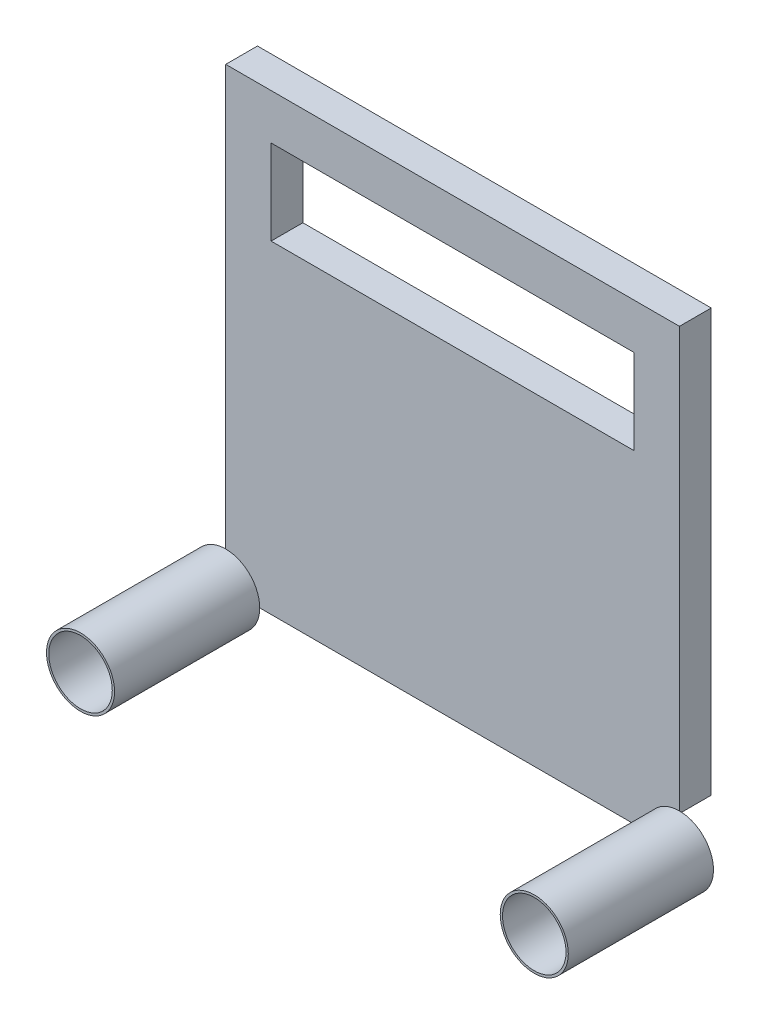
ISO-10303-21;
HEADER;
FILE_DESCRIPTION(('STEP AP214'),'2;1');
FILE_NAME('part.step','',(''),(''),'','','');
FILE_SCHEMA(('AUTOMOTIVE_DESIGN { 1 0 10303 214 1 1 1 1 }'));
ENDSEC;
DATA;
#1=APPLICATION_CONTEXT('core data for automotive mechanical design processes');
#2=APPLICATION_PROTOCOL_DEFINITION('international standard','automotive_design',2000,#1);
#3=PRODUCT_CONTEXT('',#1,'mechanical');
#4=PRODUCT('Part','Part','',(#3));
#5=PRODUCT_RELATED_PRODUCT_CATEGORY('part','',(#4));
#6=PRODUCT_DEFINITION_FORMATION('','',#4);
#7=PRODUCT_DEFINITION_CONTEXT('part definition',#1,'design');
#8=PRODUCT_DEFINITION('design','',#6,#7);
#9=PRODUCT_DEFINITION_SHAPE('','',#8);
#10=(LENGTH_UNIT() NAMED_UNIT(*) SI_UNIT(.MILLI.,.METRE.));
#11=(NAMED_UNIT(*) PLANE_ANGLE_UNIT() SI_UNIT($,.RADIAN.));
#12=(NAMED_UNIT(*) SI_UNIT($,.STERADIAN.) SOLID_ANGLE_UNIT());
#13=UNCERTAINTY_MEASURE_WITH_UNIT(LENGTH_MEASURE(1.E-05),#10,'distance_accuracy_value','');
#14=(GEOMETRIC_REPRESENTATION_CONTEXT(3) GLOBAL_UNCERTAINTY_ASSIGNED_CONTEXT((#13)) GLOBAL_UNIT_ASSIGNED_CONTEXT((#10,
#11,#12)) REPRESENTATION_CONTEXT('',''));
#15=CARTESIAN_POINT('',(0.,0.,0.));
#16=DIRECTION('',(0.,0.,1.));
#17=DIRECTION('',(1.,0.,0.));
#18=AXIS2_PLACEMENT_3D('',#15,#16,#17);
#19=CARTESIAN_POINT('',(0.,0.,3.5));
#20=DIRECTION('',(1.,0.,0.));
#21=DIRECTION('',(0.,0.,-1.));
#22=AXIS2_PLACEMENT_3D('',#19,#20,#21);
#23=PLANE('',#22);
#24=DIRECTION('',(0.,-1.,0.));
#25=VECTOR('',#24,1.);
#26=CARTESIAN_POINT('',(0.,0.,0.));
#27=LINE('',#26,#25);
#28=CARTESIAN_POINT('',(0.,50.,0.));
#29=VERTEX_POINT('',#28);
#30=CARTESIAN_POINT('',(0.,3.5,0.));
#31=VERTEX_POINT('',#30);
#32=EDGE_CURVE('E193',#29,#31,#27,.T.);
#33=ORIENTED_EDGE('',*,*,#32,.T.);
#34=DIRECTION('',(0.,0.,1.));
#35=VECTOR('',#34,1.);
#36=CARTESIAN_POINT('',(0.,3.5,0.));
#37=LINE('',#36,#35);
#38=CARTESIAN_POINT('',(0.,3.5,3.5));
#39=VERTEX_POINT('',#38);
#40=EDGE_CURVE('E179',#31,#39,#37,.T.);
#41=ORIENTED_EDGE('',*,*,#40,.T.);
#42=DIRECTION('',(0.,-1.,0.));
#43=VECTOR('',#42,1.);
#44=CARTESIAN_POINT('',(0.,0.,3.5));
#45=LINE('',#44,#43);
#46=CARTESIAN_POINT('',(0.,3.75,3.5));
#47=VERTEX_POINT('',#46);
#48=EDGE_CURVE('E200',#47,#39,#45,.T.);
#49=ORIENTED_EDGE('',*,*,#48,.F.);
#50=CARTESIAN_POINT('',(0.,50.,3.5));
#51=VERTEX_POINT('',#50);
#52=EDGE_CURVE('E197',#51,#47,#45,.T.);
#53=ORIENTED_EDGE('',*,*,#52,.F.);
#54=DIRECTION('',(0.,0.,-1.));
#55=VECTOR('',#54,1.);
#56=CARTESIAN_POINT('',(0.,50.,3.5));
#57=LINE('',#56,#55);
#58=EDGE_CURVE('E209',#51,#29,#57,.T.);
#59=ORIENTED_EDGE('',*,*,#58,.T.);
#60=EDGE_LOOP('',(#33,#41,#49,#53,#59));
#61=FACE_BOUND('',#60,.T.);
#62=ADVANCED_FACE('F37',(#61),#23,.F.);
#63=CARTESIAN_POINT('',(0.,0.,3.5));
#64=DIRECTION('',(0.,1.,0.));
#65=DIRECTION('',(0.,0.,1.));
#66=AXIS2_PLACEMENT_3D('',#63,#64,#65);
#67=PLANE('',#66);
#68=DIRECTION('',(1.,0.,0.));
#69=VECTOR('',#68,1.);
#70=CARTESIAN_POINT('',(0.,0.,3.5));
#71=LINE('',#70,#69);
#72=CARTESIAN_POINT('',(3.5,0.,3.5));
#73=VERTEX_POINT('',#72);
#74=CARTESIAN_POINT('',(3.75,0.,3.5));
#75=VERTEX_POINT('',#74);
#76=EDGE_CURVE('E201',#73,#75,#71,.T.);
#77=ORIENTED_EDGE('',*,*,#76,.F.);
#78=DIRECTION('',(0.,0.,1.));
#79=VECTOR('',#78,1.);
#80=CARTESIAN_POINT('',(3.5,0.,0.));
#81=LINE('',#80,#79);
#82=CARTESIAN_POINT('',(3.5,0.,0.));
#83=VERTEX_POINT('',#82);
#84=EDGE_CURVE('E176',#73,#83,#81,.F.);
#85=ORIENTED_EDGE('',*,*,#84,.T.);
#86=DIRECTION('',(1.,0.,0.));
#87=VECTOR('',#86,1.);
#88=CARTESIAN_POINT('',(0.,0.,0.));
#89=LINE('',#88,#87);
#90=CARTESIAN_POINT('',(46.5,0.,0.));
#91=VERTEX_POINT('',#90);
#92=EDGE_CURVE('E212',#83,#91,#89,.T.);
#93=ORIENTED_EDGE('',*,*,#92,.T.);
#94=DIRECTION('',(0.,0.,1.));
#95=VECTOR('',#94,1.);
#96=CARTESIAN_POINT('',(46.5,0.,0.));
#97=LINE('',#96,#95);
#98=CARTESIAN_POINT('',(46.5,0.,3.5));
#99=VERTEX_POINT('',#98);
#100=EDGE_CURVE('E170',#91,#99,#97,.T.);
#101=ORIENTED_EDGE('',*,*,#100,.T.);
#102=CARTESIAN_POINT('',(46.25,0.,3.5));
#103=VERTEX_POINT('',#102);
#104=EDGE_CURVE('E199',#103,#99,#71,.T.);
#105=ORIENTED_EDGE('',*,*,#104,.F.);
#106=EDGE_CURVE('E204',#75,#103,#71,.T.);
#107=ORIENTED_EDGE('',*,*,#106,.F.);
#108=EDGE_LOOP('',(#77,#85,#93,#101,#105,#107));
#109=FACE_BOUND('',#108,.T.);
#110=ADVANCED_FACE('F248',(#109),#67,.F.);
#111=CARTESIAN_POINT('',(50.,0.,3.5));
#112=DIRECTION('',(-1.,0.,0.));
#113=DIRECTION('',(0.,0.,1.));
#114=AXIS2_PLACEMENT_3D('',#111,#112,#113);
#115=PLANE('',#114);
#116=DIRECTION('',(0.,1.,0.));
#117=VECTOR('',#116,1.);
#118=CARTESIAN_POINT('',(50.,0.,3.5));
#119=LINE('',#118,#117);
#120=CARTESIAN_POINT('',(50.,3.5,3.5));
#121=VERTEX_POINT('',#120);
#122=CARTESIAN_POINT('',(50.,3.75000000000001,3.5));
#123=VERTEX_POINT('',#122);
#124=EDGE_CURVE('E205',#121,#123,#119,.T.);
#125=ORIENTED_EDGE('',*,*,#124,.F.);
#126=DIRECTION('',(0.,0.,1.));
#127=VECTOR('',#126,1.);
#128=CARTESIAN_POINT('',(50.,3.5,0.));
#129=LINE('',#128,#127);
#130=CARTESIAN_POINT('',(50.,3.5,0.));
#131=VERTEX_POINT('',#130);
#132=EDGE_CURVE('E167',#121,#131,#129,.F.);
#133=ORIENTED_EDGE('',*,*,#132,.T.);
#134=DIRECTION('',(0.,1.,0.));
#135=VECTOR('',#134,1.);
#136=CARTESIAN_POINT('',(50.,0.,0.));
#137=LINE('',#136,#135);
#138=CARTESIAN_POINT('',(50.,50.,0.));
#139=VERTEX_POINT('',#138);
#140=EDGE_CURVE('E215',#131,#139,#137,.T.);
#141=ORIENTED_EDGE('',*,*,#140,.T.);
#142=DIRECTION('',(0.,0.,-1.));
#143=VECTOR('',#142,1.);
#144=CARTESIAN_POINT('',(50.,50.,3.5));
#145=LINE('',#144,#143);
#146=CARTESIAN_POINT('',(50.,50.,3.5));
#147=VERTEX_POINT('',#146);
#148=EDGE_CURVE('E221',#147,#139,#145,.T.);
#149=ORIENTED_EDGE('',*,*,#148,.F.);
#150=EDGE_CURVE('E203',#123,#147,#119,.T.);
#151=ORIENTED_EDGE('',*,*,#150,.F.);
#152=EDGE_LOOP('',(#125,#133,#141,#149,#151));
#153=FACE_BOUND('',#152,.T.);
#154=ADVANCED_FACE('F253',(#153),#115,.F.);
#155=CARTESIAN_POINT('',(0.,50.,3.5));
#156=DIRECTION('',(0.,-1.,0.));
#157=DIRECTION('',(0.,0.,-1.));
#158=AXIS2_PLACEMENT_3D('',#155,#156,#157);
#159=PLANE('',#158);
#160=DIRECTION('',(-1.,0.,0.));
#161=VECTOR('',#160,1.);
#162=CARTESIAN_POINT('',(0.,50.,0.));
#163=LINE('',#162,#161);
#164=EDGE_CURVE('E217',#139,#29,#163,.T.);
#165=ORIENTED_EDGE('',*,*,#164,.T.);
#166=ORIENTED_EDGE('',*,*,#58,.F.);
#167=DIRECTION('',(-1.,0.,0.));
#168=VECTOR('',#167,1.);
#169=CARTESIAN_POINT('',(0.,50.,3.5));
#170=LINE('',#169,#168);
#171=EDGE_CURVE('E207',#147,#51,#170,.T.);
#172=ORIENTED_EDGE('',*,*,#171,.F.);
#173=ORIENTED_EDGE('',*,*,#148,.T.);
#174=EDGE_LOOP('',(#165,#166,#172,#173));
#175=FACE_BOUND('',#174,.T.);
#176=ADVANCED_FACE('F291',(#175),#159,.F.);
#177=CARTESIAN_POINT('',(0.,0.,3.5));
#178=DIRECTION('',(0.,0.,-1.));
#179=DIRECTION('',(-1.,0.,0.));
#180=AXIS2_PLACEMENT_3D('',#177,#178,#179);
#181=PLANE('',#180);
#182=DIRECTION('',(1.,0.,0.));
#183=VECTOR('',#182,1.);
#184=CARTESIAN_POINT('',(5.,35.6323831786116,3.5));
#185=LINE('',#184,#183);
#186=CARTESIAN_POINT('',(5.,35.6323831786116,3.5));
#187=VERTEX_POINT('',#186);
#188=CARTESIAN_POINT('',(45.,35.6323831786116,3.5));
#189=VERTEX_POINT('',#188);
#190=EDGE_CURVE('E136',#187,#189,#185,.T.);
#191=ORIENTED_EDGE('',*,*,#190,.F.);
#192=DIRECTION('',(0.,-1.,0.));
#193=VECTOR('',#192,1.);
#194=CARTESIAN_POINT('',(5.,35.6323831786116,3.5));
#195=LINE('',#194,#193);
#196=CARTESIAN_POINT('',(5.,45.,3.5));
#197=VERTEX_POINT('',#196);
#198=EDGE_CURVE('E51',#197,#187,#195,.T.);
#199=ORIENTED_EDGE('',*,*,#198,.F.);
#200=DIRECTION('',(-1.,0.,0.));
#201=VECTOR('',#200,1.);
#202=CARTESIAN_POINT('',(5.,45.,3.5));
#203=LINE('',#202,#201);
#204=CARTESIAN_POINT('',(45.,45.,3.5));
#205=VERTEX_POINT('',#204);
#206=EDGE_CURVE('E143',#205,#197,#203,.T.);
#207=ORIENTED_EDGE('',*,*,#206,.F.);
#208=DIRECTION('',(0.,1.,0.));
#209=VECTOR('',#208,1.);
#210=CARTESIAN_POINT('',(45.,35.6323831786116,3.5));
#211=LINE('',#210,#209);
#212=EDGE_CURVE('E127',#189,#205,#211,.T.);
#213=ORIENTED_EDGE('',*,*,#212,.F.);
#214=EDGE_LOOP('',(#191,#199,#207,#213));
#215=FACE_BOUND('',#214,.T.);
#216=CARTESIAN_POINT('',(50.,0.,3.5));
#217=DIRECTION('',(0.,0.,1.));
#218=DIRECTION('',(1.,0.,0.));
#219=AXIS2_PLACEMENT_3D('',#216,#217,#218);
#220=CIRCLE('',#219,3.75000000000001);
#221=EDGE_CURVE('E183',#123,#103,#220,.T.);
#222=ORIENTED_EDGE('',*,*,#221,.F.);
#223=ORIENTED_EDGE('',*,*,#150,.T.);
#224=ORIENTED_EDGE('',*,*,#171,.T.);
#225=ORIENTED_EDGE('',*,*,#52,.T.);
#226=CARTESIAN_POINT('',(0.,0.,3.5));
#227=DIRECTION('',(0.,0.,1.));
#228=DIRECTION('',(1.,0.,0.));
#229=AXIS2_PLACEMENT_3D('',#226,#227,#228);
#230=CIRCLE('',#229,3.75);
#231=EDGE_CURVE('E194',#75,#47,#230,.T.);
#232=ORIENTED_EDGE('',*,*,#231,.F.);
#233=ORIENTED_EDGE('',*,*,#106,.T.);
#234=EDGE_LOOP('',(#222,#223,#224,#225,#232,#233));
#235=FACE_BOUND('',#234,.T.);
#236=ADVANCED_FACE('F140',(#215,#235),#181,.F.);
#237=CARTESIAN_POINT('',(0.,0.,0.));
#238=DIRECTION('',(0.,0.,-1.));
#239=DIRECTION('',(-1.,0.,0.));
#240=AXIS2_PLACEMENT_3D('',#237,#238,#239);
#241=PLANE('',#240);
#242=DIRECTION('',(0.,1.,0.));
#243=VECTOR('',#242,1.);
#244=CARTESIAN_POINT('',(5.,0.,0.));
#245=LINE('',#244,#243);
#246=CARTESIAN_POINT('',(5.,35.6323831786116,0.));
#247=VERTEX_POINT('',#246);
#248=CARTESIAN_POINT('',(5.,45.,0.));
#249=VERTEX_POINT('',#248);
#250=EDGE_CURVE('E11',#247,#249,#245,.T.);
#251=ORIENTED_EDGE('',*,*,#250,.F.);
#252=DIRECTION('',(-1.,0.,0.));
#253=VECTOR('',#252,1.);
#254=CARTESIAN_POINT('',(0.,35.6323831786116,0.));
#255=LINE('',#254,#253);
#256=CARTESIAN_POINT('',(45.,35.6323831786116,0.));
#257=VERTEX_POINT('',#256);
#258=EDGE_CURVE('E224',#257,#247,#255,.T.);
#259=ORIENTED_EDGE('',*,*,#258,.F.);
#260=DIRECTION('',(0.,-1.,0.));
#261=VECTOR('',#260,1.);
#262=CARTESIAN_POINT('',(45.,0.,0.));
#263=LINE('',#262,#261);
#264=CARTESIAN_POINT('',(45.,45.,0.));
#265=VERTEX_POINT('',#264);
#266=EDGE_CURVE('E130',#265,#257,#263,.T.);
#267=ORIENTED_EDGE('',*,*,#266,.F.);
#268=DIRECTION('',(1.,0.,0.));
#269=VECTOR('',#268,1.);
#270=CARTESIAN_POINT('',(0.,45.,0.));
#271=LINE('',#270,#269);
#272=EDGE_CURVE('E44',#249,#265,#271,.T.);
#273=ORIENTED_EDGE('',*,*,#272,.F.);
#274=EDGE_LOOP('',(#251,#259,#267,#273));
#275=FACE_BOUND('',#274,.T.);
#276=CARTESIAN_POINT('',(0.,0.,0.));
#277=DIRECTION('',(0.,0.,1.));
#278=DIRECTION('',(1.,0.,0.));
#279=AXIS2_PLACEMENT_3D('',#276,#277,#278);
#280=CIRCLE('',#279,3.5);
#281=EDGE_CURVE('E153',#83,#31,#280,.T.);
#282=ORIENTED_EDGE('',*,*,#281,.T.);
#283=ORIENTED_EDGE('',*,*,#32,.F.);
#284=ORIENTED_EDGE('',*,*,#164,.F.);
#285=ORIENTED_EDGE('',*,*,#140,.F.);
#286=CARTESIAN_POINT('',(50.,0.,0.));
#287=DIRECTION('',(0.,0.,1.));
#288=DIRECTION('',(1.,0.,0.));
#289=AXIS2_PLACEMENT_3D('',#286,#287,#288);
#290=CIRCLE('',#289,3.5);
#291=EDGE_CURVE('E150',#131,#91,#290,.T.);
#292=ORIENTED_EDGE('',*,*,#291,.T.);
#293=ORIENTED_EDGE('',*,*,#92,.F.);
#294=EDGE_LOOP('',(#282,#283,#284,#285,#292,#293));
#295=FACE_BOUND('',#294,.T.);
#296=ADVANCED_FACE('F232',(#275,#295),#241,.T.);
#297=CARTESIAN_POINT('',(0.,0.,3.5));
#298=DIRECTION('',(0.,0.,1.));
#299=DIRECTION('',(1.,0.,0.));
#300=AXIS2_PLACEMENT_3D('',#297,#298,#299);
#301=PLANE('',#300);
#302=ORIENTED_EDGE('',*,*,#48,.T.);
#303=CARTESIAN_POINT('',(0.,0.,3.5));
#304=DIRECTION('',(0.,0.,1.));
#305=DIRECTION('',(1.,0.,0.));
#306=AXIS2_PLACEMENT_3D('',#303,#304,#305);
#307=CIRCLE('',#306,3.5);
#308=EDGE_CURVE('E173',#39,#73,#307,.T.);
#309=ORIENTED_EDGE('',*,*,#308,.T.);
#310=ORIENTED_EDGE('',*,*,#76,.T.);
#311=EDGE_CURVE('E186',#47,#75,#230,.T.);
#312=ORIENTED_EDGE('',*,*,#311,.F.);
#313=EDGE_LOOP('',(#302,#309,#310,#312));
#314=FACE_BOUND('',#313,.T.);
#315=ADVANCED_FACE('F271',(#314),#301,.F.);
#316=CARTESIAN_POINT('',(0.,0.,19.5));
#317=DIRECTION('',(0.,0.,-1.));
#318=DIRECTION('',(-1.,0.,0.));
#319=AXIS2_PLACEMENT_3D('',#316,#317,#318);
#320=CYLINDRICAL_SURFACE('',#319,3.75);
#321=CARTESIAN_POINT('',(0.,0.,19.5));
#322=DIRECTION('',(0.,0.,1.));
#323=DIRECTION('',(1.,0.,0.));
#324=AXIS2_PLACEMENT_3D('',#321,#322,#323);
#325=CIRCLE('',#324,3.75);
#326=CARTESIAN_POINT('',(3.75,0.,19.5));
#327=VERTEX_POINT('',#326);
#328=EDGE_CURVE('E190',#327,#327,#325,.T.);
#329=ORIENTED_EDGE('',*,*,#328,.F.);
#330=EDGE_LOOP('',(#329));
#331=FACE_BOUND('',#330,.T.);
#332=ORIENTED_EDGE('',*,*,#231,.T.);
#333=ORIENTED_EDGE('',*,*,#311,.T.);
#334=EDGE_LOOP('',(#332,#333));
#335=FACE_BOUND('',#334,.T.);
#336=ADVANCED_FACE('F274',(#331,#335),#320,.T.);
#337=CARTESIAN_POINT('',(0.,0.,19.5));
#338=DIRECTION('',(0.,0.,1.));
#339=DIRECTION('',(1.,0.,0.));
#340=AXIS2_PLACEMENT_3D('',#337,#338,#339);
#341=PLANE('',#340);
#342=CARTESIAN_POINT('',(0.,0.,19.5));
#343=DIRECTION('',(0.,0.,1.));
#344=DIRECTION('',(1.,0.,0.));
#345=AXIS2_PLACEMENT_3D('',#342,#343,#344);
#346=CIRCLE('',#345,3.5);
#347=CARTESIAN_POINT('',(3.5,0.,19.5));
#348=VERTEX_POINT('',#347);
#349=EDGE_CURVE('E157',#348,#348,#346,.T.);
#350=ORIENTED_EDGE('',*,*,#349,.F.);
#351=EDGE_LOOP('',(#350));
#352=FACE_BOUND('',#351,.T.);
#353=ORIENTED_EDGE('',*,*,#328,.T.);
#354=EDGE_LOOP('',(#353));
#355=FACE_BOUND('',#354,.T.);
#356=ADVANCED_FACE('F276',(#352,#355),#341,.T.);
#357=CARTESIAN_POINT('',(50.,0.,3.5));
#358=DIRECTION('',(0.,0.,1.));
#359=DIRECTION('',(1.,0.,0.));
#360=AXIS2_PLACEMENT_3D('',#357,#358,#359);
#361=PLANE('',#360);
#362=ORIENTED_EDGE('',*,*,#104,.T.);
#363=CARTESIAN_POINT('',(50.,0.,3.5));
#364=DIRECTION('',(0.,0.,1.));
#365=DIRECTION('',(1.,0.,0.));
#366=AXIS2_PLACEMENT_3D('',#363,#364,#365);
#367=CIRCLE('',#366,3.5);
#368=EDGE_CURVE('E156',#99,#121,#367,.T.);
#369=ORIENTED_EDGE('',*,*,#368,.T.);
#370=ORIENTED_EDGE('',*,*,#124,.T.);
#371=EDGE_CURVE('E187',#103,#123,#220,.T.);
#372=ORIENTED_EDGE('',*,*,#371,.F.);
#373=EDGE_LOOP('',(#362,#369,#370,#372));
#374=FACE_BOUND('',#373,.T.);
#375=ADVANCED_FACE('F283',(#374),#361,.F.);
#376=CARTESIAN_POINT('',(50.,0.,19.5));
#377=DIRECTION('',(0.,0.,-1.));
#378=DIRECTION('',(-1.,0.,0.));
#379=AXIS2_PLACEMENT_3D('',#376,#377,#378);
#380=CYLINDRICAL_SURFACE('',#379,3.75000000000001);
#381=CARTESIAN_POINT('',(50.,0.,19.5));
#382=DIRECTION('',(0.,0.,1.));
#383=DIRECTION('',(1.,0.,0.));
#384=AXIS2_PLACEMENT_3D('',#381,#382,#383);
#385=CIRCLE('',#384,3.75000000000001);
#386=CARTESIAN_POINT('',(53.75,0.,19.5));
#387=VERTEX_POINT('',#386);
#388=EDGE_CURVE('E182',#387,#387,#385,.T.);
#389=ORIENTED_EDGE('',*,*,#388,.F.);
#390=EDGE_LOOP('',(#389));
#391=FACE_BOUND('',#390,.T.);
#392=ORIENTED_EDGE('',*,*,#221,.T.);
#393=ORIENTED_EDGE('',*,*,#371,.T.);
#394=EDGE_LOOP('',(#392,#393));
#395=FACE_BOUND('',#394,.T.);
#396=ADVANCED_FACE('F309',(#391,#395),#380,.T.);
#397=CARTESIAN_POINT('',(50.,0.,19.5));
#398=DIRECTION('',(0.,0.,1.));
#399=DIRECTION('',(1.,0.,0.));
#400=AXIS2_PLACEMENT_3D('',#397,#398,#399);
#401=PLANE('',#400);
#402=CARTESIAN_POINT('',(50.,0.,19.5));
#403=DIRECTION('',(0.,0.,1.));
#404=DIRECTION('',(1.,0.,0.));
#405=AXIS2_PLACEMENT_3D('',#402,#403,#404);
#406=CIRCLE('',#405,3.5);
#407=CARTESIAN_POINT('',(53.5,0.,19.5));
#408=VERTEX_POINT('',#407);
#409=EDGE_CURVE('E160',#408,#408,#406,.T.);
#410=ORIENTED_EDGE('',*,*,#409,.F.);
#411=EDGE_LOOP('',(#410));
#412=FACE_BOUND('',#411,.T.);
#413=ORIENTED_EDGE('',*,*,#388,.T.);
#414=EDGE_LOOP('',(#413));
#415=FACE_BOUND('',#414,.T.);
#416=ADVANCED_FACE('F311',(#412,#415),#401,.T.);
#417=CARTESIAN_POINT('',(50.,0.,0.));
#418=DIRECTION('',(0.,0.,1.));
#419=DIRECTION('',(1.,0.,0.));
#420=AXIS2_PLACEMENT_3D('',#417,#418,#419);
#421=CYLINDRICAL_SURFACE('',#420,3.5);
#422=ORIENTED_EDGE('',*,*,#409,.T.);
#423=EDGE_LOOP('',(#422));
#424=FACE_BOUND('',#423,.T.);
#425=ORIENTED_EDGE('',*,*,#291,.F.);
#426=ORIENTED_EDGE('',*,*,#132,.F.);
#427=ORIENTED_EDGE('',*,*,#368,.F.);
#428=ORIENTED_EDGE('',*,*,#100,.F.);
#429=EDGE_LOOP('',(#425,#426,#427,#428));
#430=FACE_BOUND('',#429,.T.);
#431=ADVANCED_FACE('F243',(#424,#430),#421,.F.);
#432=CARTESIAN_POINT('',(0.,0.,0.));
#433=DIRECTION('',(0.,0.,1.));
#434=DIRECTION('',(1.,0.,0.));
#435=AXIS2_PLACEMENT_3D('',#432,#433,#434);
#436=CYLINDRICAL_SURFACE('',#435,3.5);
#437=ORIENTED_EDGE('',*,*,#349,.T.);
#438=EDGE_LOOP('',(#437));
#439=FACE_BOUND('',#438,.T.);
#440=ORIENTED_EDGE('',*,*,#281,.F.);
#441=ORIENTED_EDGE('',*,*,#84,.F.);
#442=ORIENTED_EDGE('',*,*,#308,.F.);
#443=ORIENTED_EDGE('',*,*,#40,.F.);
#444=EDGE_LOOP('',(#440,#441,#442,#443));
#445=FACE_BOUND('',#444,.T.);
#446=ADVANCED_FACE('F236',(#439,#445),#436,.F.);
#447=CARTESIAN_POINT('',(5.,35.6323831786116,-16.));
#448=DIRECTION('',(-1.,0.,0.));
#449=DIRECTION('',(0.,0.,1.));
#450=AXIS2_PLACEMENT_3D('',#447,#448,#449);
#451=PLANE('',#450);
#452=ORIENTED_EDGE('',*,*,#250,.T.);
#453=DIRECTION('',(0.,0.,1.));
#454=VECTOR('',#453,1.);
#455=CARTESIAN_POINT('',(5.,45.,-16.));
#456=LINE('',#455,#454);
#457=EDGE_CURVE('E148',#249,#197,#456,.T.);
#458=ORIENTED_EDGE('',*,*,#457,.T.);
#459=ORIENTED_EDGE('',*,*,#198,.T.);
#460=DIRECTION('',(0.,0.,1.));
#461=VECTOR('',#460,1.);
#462=CARTESIAN_POINT('',(5.,35.6323831786116,-16.));
#463=LINE('',#462,#461);
#464=EDGE_CURVE('E133',#247,#187,#463,.T.);
#465=ORIENTED_EDGE('',*,*,#464,.F.);
#466=EDGE_LOOP('',(#452,#458,#459,#465));
#467=FACE_BOUND('',#466,.T.);
#468=ADVANCED_FACE('F234',(#467),#451,.F.);
#469=CARTESIAN_POINT('',(5.,45.,-16.));
#470=DIRECTION('',(0.,1.,0.));
#471=DIRECTION('',(0.,0.,1.));
#472=AXIS2_PLACEMENT_3D('',#469,#470,#471);
#473=PLANE('',#472);
#474=ORIENTED_EDGE('',*,*,#272,.T.);
#475=DIRECTION('',(0.,0.,1.));
#476=VECTOR('',#475,1.);
#477=CARTESIAN_POINT('',(45.,45.,-16.));
#478=LINE('',#477,#476);
#479=EDGE_CURVE('E132',#265,#205,#478,.T.);
#480=ORIENTED_EDGE('',*,*,#479,.T.);
#481=ORIENTED_EDGE('',*,*,#206,.T.);
#482=ORIENTED_EDGE('',*,*,#457,.F.);
#483=EDGE_LOOP('',(#474,#480,#481,#482));
#484=FACE_BOUND('',#483,.T.);
#485=ADVANCED_FACE('F229',(#484),#473,.F.);
#486=CARTESIAN_POINT('',(45.,35.6323831786116,-16.));
#487=DIRECTION('',(1.,0.,0.));
#488=DIRECTION('',(0.,0.,-1.));
#489=AXIS2_PLACEMENT_3D('',#486,#487,#488);
#490=PLANE('',#489);
#491=ORIENTED_EDGE('',*,*,#266,.T.);
#492=DIRECTION('',(0.,0.,1.));
#493=VECTOR('',#492,1.);
#494=CARTESIAN_POINT('',(45.,35.6323831786116,-16.));
#495=LINE('',#494,#493);
#496=EDGE_CURVE('E59',#257,#189,#495,.T.);
#497=ORIENTED_EDGE('',*,*,#496,.T.);
#498=ORIENTED_EDGE('',*,*,#212,.T.);
#499=ORIENTED_EDGE('',*,*,#479,.F.);
#500=EDGE_LOOP('',(#491,#497,#498,#499));
#501=FACE_BOUND('',#500,.T.);
#502=ADVANCED_FACE('F124',(#501),#490,.F.);
#503=CARTESIAN_POINT('',(5.,35.6323831786116,-16.));
#504=DIRECTION('',(0.,-1.,0.));
#505=DIRECTION('',(0.,0.,-1.));
#506=AXIS2_PLACEMENT_3D('',#503,#504,#505);
#507=PLANE('',#506);
#508=ORIENTED_EDGE('',*,*,#258,.T.);
#509=ORIENTED_EDGE('',*,*,#464,.T.);
#510=ORIENTED_EDGE('',*,*,#190,.T.);
#511=ORIENTED_EDGE('',*,*,#496,.F.);
#512=EDGE_LOOP('',(#508,#509,#510,#511));
#513=FACE_BOUND('',#512,.T.);
#514=ADVANCED_FACE('F137',(#513),#507,.F.);
#515=CLOSED_SHELL('',(#62,#110,#154,#176,#236,#296,#315,#336,#356,#375,#396,#416,#431,#446,#468,
#485,#502,#514));
#516=MANIFOLD_SOLID_BREP('B2',#515);
#517=ADVANCED_BREP_SHAPE_REPRESENTATION('',(#18,#516),#14);
#518=SHAPE_DEFINITION_REPRESENTATION(#9,#517);
ENDSEC;
END-ISO-10303-21;
